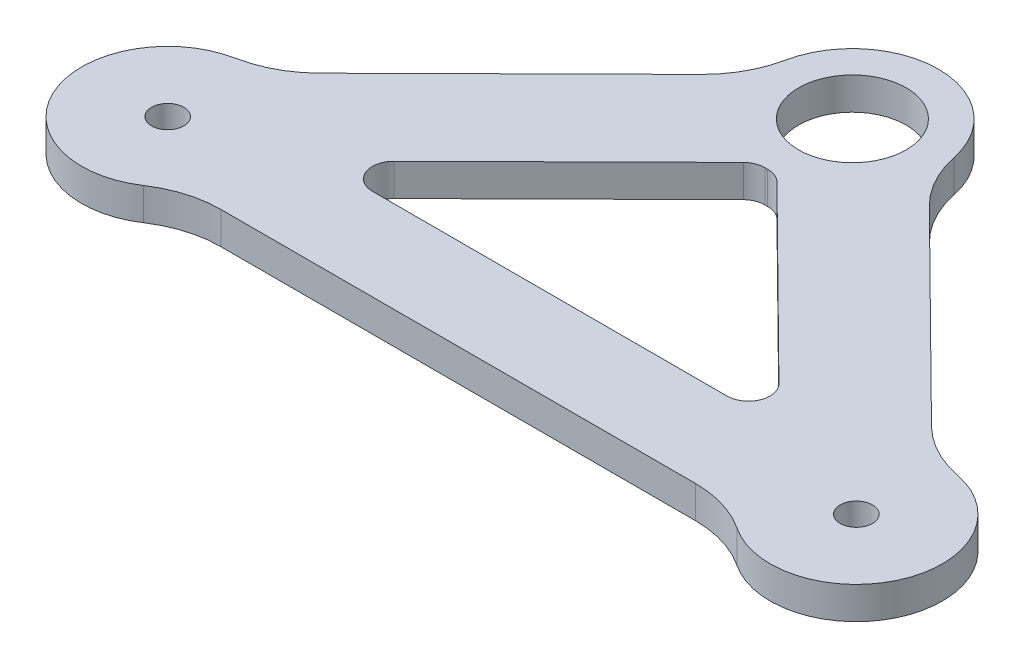
ISO-10303-21;
HEADER;
FILE_DESCRIPTION(('STEP AP214'),'2;1');
FILE_NAME('part.step','',(''),(''),'','','');
FILE_SCHEMA(('AUTOMOTIVE_DESIGN { 1 0 10303 214 1 1 1 1 }'));
ENDSEC;
DATA;
#1=APPLICATION_CONTEXT('core data for automotive mechanical design processes');
#2=APPLICATION_PROTOCOL_DEFINITION('international standard','automotive_design',2000,#1);
#3=PRODUCT_CONTEXT('',#1,'mechanical');
#4=PRODUCT('Part','Part','',(#3));
#5=PRODUCT_RELATED_PRODUCT_CATEGORY('part','',(#4));
#6=PRODUCT_DEFINITION_FORMATION('','',#4);
#7=PRODUCT_DEFINITION_CONTEXT('part definition',#1,'design');
#8=PRODUCT_DEFINITION('design','',#6,#7);
#9=PRODUCT_DEFINITION_SHAPE('','',#8);
#10=(LENGTH_UNIT() NAMED_UNIT(*) SI_UNIT(.MILLI.,.METRE.));
#11=(NAMED_UNIT(*) PLANE_ANGLE_UNIT() SI_UNIT($,.RADIAN.));
#12=(NAMED_UNIT(*) SI_UNIT($,.STERADIAN.) SOLID_ANGLE_UNIT());
#13=UNCERTAINTY_MEASURE_WITH_UNIT(LENGTH_MEASURE(1.E-05),#10,'distance_accuracy_value','');
#14=(GEOMETRIC_REPRESENTATION_CONTEXT(3) GLOBAL_UNCERTAINTY_ASSIGNED_CONTEXT((#13)) GLOBAL_UNIT_ASSIGNED_CONTEXT((#10,
#11,#12)) REPRESENTATION_CONTEXT('',''));
#15=CARTESIAN_POINT('',(0.,0.,0.));
#16=DIRECTION('',(0.,0.,1.));
#17=DIRECTION('',(1.,0.,0.));
#18=AXIS2_PLACEMENT_3D('',#15,#16,#17);
#19=CARTESIAN_POINT('',(0.,3.,0.));
#20=DIRECTION('',(1.,0.,0.));
#21=DIRECTION('',(0.,0.,-1.));
#22=AXIS2_PLACEMENT_3D('',#19,#20,#21);
#23=PLANE('',#22);
#24=DIRECTION('',(0.,0.,1.));
#25=VECTOR('',#24,1.);
#26=CARTESIAN_POINT('',(0.,0.,0.));
#27=LINE('',#26,#25);
#28=CARTESIAN_POINT('',(0.,0.,-22.5169864866705));
#29=VERTEX_POINT('',#28);
#30=CARTESIAN_POINT('',(0.,0.,-22.5158134829802));
#31=VERTEX_POINT('',#30);
#32=EDGE_CURVE('E197',#29,#31,#27,.T.);
#33=ORIENTED_EDGE('',*,*,#32,.F.);
#34=DIRECTION('',(0.,-1.,0.));
#35=VECTOR('',#34,1.);
#36=CARTESIAN_POINT('',(0.,3.,-22.5169864866705));
#37=LINE('',#36,#35);
#38=CARTESIAN_POINT('',(0.,3.,-22.5169864866705));
#39=VERTEX_POINT('',#38);
#40=EDGE_CURVE('E191',#39,#29,#37,.T.);
#41=ORIENTED_EDGE('',*,*,#40,.F.);
#42=DIRECTION('',(0.,0.,1.));
#43=VECTOR('',#42,1.);
#44=CARTESIAN_POINT('',(0.,3.,0.));
#45=LINE('',#44,#43);
#46=CARTESIAN_POINT('',(0.,3.,-22.5158134829802));
#47=VERTEX_POINT('',#46);
#48=EDGE_CURVE('E194',#39,#47,#45,.T.);
#49=ORIENTED_EDGE('',*,*,#48,.T.);
#50=DIRECTION('',(0.,-1.,0.));
#51=VECTOR('',#50,1.);
#52=CARTESIAN_POINT('',(0.,3.,-22.5158134829802));
#53=LINE('',#52,#51);
#54=EDGE_CURVE('E229',#47,#31,#53,.T.);
#55=ORIENTED_EDGE('',*,*,#54,.T.);
#56=EDGE_LOOP('',(#33,#41,#49,#55));
#57=FACE_BOUND('',#56,.T.);
#58=ADVANCED_FACE('F36',(#57),#23,.T.);
#59=CARTESIAN_POINT('',(11.2577723363418,3.,-11.3858986330326));
#60=DIRECTION('',(0.703094453053331,0.,-0.711096470308802));
#61=DIRECTION('',(-0.711096470308802,0.,-0.703094453053331));
#62=AXIS2_PLACEMENT_3D('',#59,#60,#61);
#63=PLANE('',#62);
#64=DIRECTION('',(0.711096470308802,0.,0.703094453053331));
#65=VECTOR('',#64,1.);
#66=CARTESIAN_POINT('',(11.2577723363418,0.,-11.3858986330326));
#67=LINE('',#66,#65);
#68=CARTESIAN_POINT('',(0.000593189258373851,0.,-22.5163999726115));
#69=VERTEX_POINT('',#68);
#70=EDGE_CURVE('E260',#29,#69,#67,.T.);
#71=ORIENTED_EDGE('',*,*,#70,.T.);
#72=DIRECTION('',(0.,-1.,0.));
#73=VECTOR('',#72,1.);
#74=CARTESIAN_POINT('',(0.000593189258373851,3.,-22.5163999726115));
#75=LINE('',#74,#73);
#76=CARTESIAN_POINT('',(0.000593189258373851,3.,-22.5163999726115));
#77=VERTEX_POINT('',#76);
#78=EDGE_CURVE('E202',#77,#69,#75,.T.);
#79=ORIENTED_EDGE('',*,*,#78,.F.);
#80=DIRECTION('',(0.711096470308802,0.,0.703094453053331));
#81=VECTOR('',#80,1.);
#82=CARTESIAN_POINT('',(11.2577723363418,3.,-11.3858986330326));
#83=LINE('',#82,#81);
#84=EDGE_CURVE('E205',#39,#77,#83,.T.);
#85=ORIENTED_EDGE('',*,*,#84,.F.);
#86=ORIENTED_EDGE('',*,*,#40,.T.);
#87=EDGE_LOOP('',(#71,#79,#85,#86));
#88=FACE_BOUND('',#87,.T.);
#89=ADVANCED_FACE('F206',(#88),#63,.F.);
#90=CARTESIAN_POINT('',(11.2577723363418,3.,-11.3858986330326));
#91=DIRECTION('',(0.703094453053331,0.,-0.711096470308802));
#92=DIRECTION('',(-0.711096470308802,0.,-0.703094453053331));
#93=AXIS2_PLACEMENT_3D('',#90,#91,#92);
#94=PLANE('',#93);
#95=DIRECTION('',(0.711096470308802,0.,0.703094453053331));
#96=VECTOR('',#95,1.);
#97=CARTESIAN_POINT('',(11.2577723363418,0.,-11.3858986330326));
#98=LINE('',#97,#96);
#99=CARTESIAN_POINT('',(1.56408418580728,0.,-20.9705030472689));
#100=VERTEX_POINT('',#99);
#101=CARTESIAN_POINT('',(17.8876045404997,0.,-4.83067238448501));
#102=VERTEX_POINT('',#101);
#103=EDGE_CURVE('E248',#100,#102,#98,.T.);
#104=ORIENTED_EDGE('',*,*,#103,.T.);
#105=DIRECTION('',(0.,-1.,0.));
#106=VECTOR('',#105,1.);
#107=CARTESIAN_POINT('',(17.8876045404997,3.,-4.83067238448501));
#108=LINE('',#107,#106);
#109=CARTESIAN_POINT('',(17.8876045404997,3.,-4.83067238448501));
#110=VERTEX_POINT('',#109);
#111=EDGE_CURVE('E338',#102,#110,#108,.F.);
#112=ORIENTED_EDGE('',*,*,#111,.T.);
#113=DIRECTION('',(0.711096470308802,0.,0.703094453053331));
#114=VECTOR('',#113,1.);
#115=CARTESIAN_POINT('',(11.2577723363418,3.,-11.3858986330326));
#116=LINE('',#115,#114);
#117=CARTESIAN_POINT('',(1.56408418580728,3.,-20.9705030472689));
#118=VERTEX_POINT('',#117);
#119=EDGE_CURVE('E383',#118,#110,#116,.T.);
#120=ORIENTED_EDGE('',*,*,#119,.F.);
#121=DIRECTION('',(0.,1.,0.));
#122=VECTOR('',#121,1.);
#123=CARTESIAN_POINT('',(1.56408418580728,0.,-20.9705030472689));
#124=LINE('',#123,#122);
#125=EDGE_CURVE('E335',#118,#100,#124,.F.);
#126=ORIENTED_EDGE('',*,*,#125,.T.);
#127=EDGE_LOOP('',(#104,#112,#120,#126));
#128=FACE_BOUND('',#127,.T.);
#129=ADVANCED_FACE('F381',(#128),#94,.F.);
#130=CARTESIAN_POINT('',(0.,3.,-1.4084794438674));
#131=DIRECTION('',(0.,0.,-1.));
#132=DIRECTION('',(-1.,0.,0.));
#133=AXIS2_PLACEMENT_3D('',#130,#131,#132);
#134=PLANE('',#133);
#135=DIRECTION('',(1.,0.,0.));
#136=VECTOR('',#135,1.);
#137=CARTESIAN_POINT('',(0.,3.,-1.4084794438674));
#138=LINE('',#137,#136);
#139=CARTESIAN_POINT('',(-16.4809742625331,3.,-1.4084794438674));
#140=VERTEX_POINT('',#139);
#141=CARTESIAN_POINT('',(16.481415634393,3.,-1.4084794438674));
#142=VERTEX_POINT('',#141);
#143=EDGE_CURVE('E394',#140,#142,#138,.T.);
#144=ORIENTED_EDGE('',*,*,#143,.T.);
#145=DIRECTION('',(0.,-1.,0.));
#146=VECTOR('',#145,1.);
#147=CARTESIAN_POINT('',(16.481415634393,3.,-1.4084794438674));
#148=LINE('',#147,#146);
#149=CARTESIAN_POINT('',(16.481415634393,0.,-1.4084794438674));
#150=VERTEX_POINT('',#149);
#151=EDGE_CURVE('E332',#142,#150,#148,.T.);
#152=ORIENTED_EDGE('',*,*,#151,.T.);
#153=DIRECTION('',(1.,0.,0.));
#154=VECTOR('',#153,1.);
#155=CARTESIAN_POINT('',(0.,0.,-1.4084794438674));
#156=LINE('',#155,#154);
#157=CARTESIAN_POINT('',(-16.4809742625331,0.,-1.4084794438674));
#158=VERTEX_POINT('',#157);
#159=EDGE_CURVE('E251',#158,#150,#156,.T.);
#160=ORIENTED_EDGE('',*,*,#159,.F.);
#161=DIRECTION('',(0.,-1.,0.));
#162=VECTOR('',#161,1.);
#163=CARTESIAN_POINT('',(-16.4809742625331,3.,-1.4084794438674));
#164=LINE('',#163,#162);
#165=EDGE_CURVE('E330',#158,#140,#164,.F.);
#166=ORIENTED_EDGE('',*,*,#165,.T.);
#167=EDGE_LOOP('',(#144,#152,#160,#166));
#168=FACE_BOUND('',#167,.T.);
#169=ADVANCED_FACE('F391',(#168),#134,.T.);
#170=CARTESIAN_POINT('',(-11.257180556488,3.,-11.3857743242329));
#171=DIRECTION('',(-0.703079645313617,0.,-0.711111111111111));
#172=DIRECTION('',(-0.711111111111111,0.,0.703079645313617));
#173=AXIS2_PLACEMENT_3D('',#170,#171,#172);
#174=PLANE('',#173);
#175=DIRECTION('',(0.711111111111111,0.,-0.703079645313617));
#176=VECTOR('',#175,1.);
#177=CARTESIAN_POINT('',(-11.257180556488,3.,-11.3857743242329));
#178=LINE('',#177,#176);
#179=CARTESIAN_POINT('',(-17.8871335531603,3.,-4.83070166608962));
#180=VERTEX_POINT('',#179);
#181=CARTESIAN_POINT('',(-1.56295087817351,3.,-20.9705149608521));
#182=VERTEX_POINT('',#181);
#183=EDGE_CURVE('E215',#180,#182,#178,.T.);
#184=ORIENTED_EDGE('',*,*,#183,.F.);
#185=DIRECTION('',(0.,-1.,0.));
#186=VECTOR('',#185,1.);
#187=CARTESIAN_POINT('',(-17.8871335531603,3.,-4.83070166608962));
#188=LINE('',#187,#186);
#189=CARTESIAN_POINT('',(-17.8871335531603,0.,-4.83070166608962));
#190=VERTEX_POINT('',#189);
#191=EDGE_CURVE('E342',#180,#190,#188,.T.);
#192=ORIENTED_EDGE('',*,*,#191,.T.);
#193=DIRECTION('',(0.711111111111111,0.,-0.703079645313617));
#194=VECTOR('',#193,1.);
#195=CARTESIAN_POINT('',(-11.257180556488,0.,-11.3857743242329));
#196=LINE('',#195,#194);
#197=CARTESIAN_POINT('',(-1.56295087817351,0.,-20.9705149608521));
#198=VERTEX_POINT('',#197);
#199=EDGE_CURVE('E254',#190,#198,#196,.T.);
#200=ORIENTED_EDGE('',*,*,#199,.T.);
#201=DIRECTION('',(0.,1.,0.));
#202=VECTOR('',#201,1.);
#203=CARTESIAN_POINT('',(-1.56295087817351,3.,-20.9705149608521));
#204=LINE('',#203,#202);
#205=EDGE_CURVE('E340',#198,#182,#204,.T.);
#206=ORIENTED_EDGE('',*,*,#205,.T.);
#207=EDGE_LOOP('',(#184,#192,#200,#206));
#208=FACE_BOUND('',#207,.T.);
#209=ADVANCED_FACE('F371',(#208),#174,.F.);
#210=CARTESIAN_POINT('',(0.,3.,7.09152055613258));
#211=DIRECTION('',(0.,0.,-1.));
#212=DIRECTION('',(-1.,0.,0.));
#213=AXIS2_PLACEMENT_3D('',#210,#211,#212);
#214=PLANE('',#213);
#215=DIRECTION('',(1.,0.,0.));
#216=VECTOR('',#215,1.);
#217=CARTESIAN_POINT('',(0.,0.,7.09152055613258));
#218=LINE('',#217,#216);
#219=CARTESIAN_POINT('',(-22.0501256289338,0.,7.09152055613258));
#220=VERTEX_POINT('',#219);
#221=CARTESIAN_POINT('',(22.0501256289338,0.,7.09152055613259));
#222=VERTEX_POINT('',#221);
#223=EDGE_CURVE('E230',#220,#222,#218,.T.);
#224=ORIENTED_EDGE('',*,*,#223,.T.);
#225=DIRECTION('',(0.,1.,0.));
#226=VECTOR('',#225,1.);
#227=CARTESIAN_POINT('',(22.0501256289338,3.,7.09152055613259));
#228=LINE('',#227,#226);
#229=CARTESIAN_POINT('',(22.0501256289338,3.,7.09152055613259));
#230=VERTEX_POINT('',#229);
#231=EDGE_CURVE('E294',#222,#230,#228,.T.);
#232=ORIENTED_EDGE('',*,*,#231,.T.);
#233=DIRECTION('',(1.,0.,0.));
#234=VECTOR('',#233,1.);
#235=CARTESIAN_POINT('',(0.,3.,7.09152055613258));
#236=LINE('',#235,#234);
#237=CARTESIAN_POINT('',(-22.0501256289338,3.,7.09152055613258));
#238=VERTEX_POINT('',#237);
#239=EDGE_CURVE('E274',#238,#230,#236,.T.);
#240=ORIENTED_EDGE('',*,*,#239,.F.);
#241=DIRECTION('',(0.,1.,0.));
#242=VECTOR('',#241,1.);
#243=CARTESIAN_POINT('',(-22.0501256289338,0.,7.09152055613258));
#244=LINE('',#243,#242);
#245=EDGE_CURVE('E291',#238,#220,#244,.F.);
#246=ORIENTED_EDGE('',*,*,#245,.T.);
#247=EDGE_LOOP('',(#224,#232,#240,#246));
#248=FACE_BOUND('',#247,.T.);
#249=ADVANCED_FACE('F470',(#248),#214,.F.);
#250=CARTESIAN_POINT('',(32.,3.,2.09152055613259));
#251=DIRECTION('',(0.,-1.,0.));
#252=DIRECTION('',(0.,0.,-1.));
#253=AXIS2_PLACEMENT_3D('',#250,#251,#252);
#254=CYLINDRICAL_SURFACE('',#253,8.);
#255=CARTESIAN_POINT('',(32.,0.,2.09152055613259));
#256=DIRECTION('',(0.,1.,0.));
#257=DIRECTION('',(0.,0.,1.));
#258=AXIS2_PLACEMENT_3D('',#255,#256,#257);
#259=CIRCLE('',#258,8.);
#260=CARTESIAN_POINT('',(27.5778336128595,0.,8.75818722279926));
#261=VERTEX_POINT('',#260);
#262=CARTESIAN_POINT('',(33.5419702056243,0.,-5.7584684811188));
#263=VERTEX_POINT('',#262);
#264=EDGE_CURVE('E233',#261,#263,#259,.T.);
#265=ORIENTED_EDGE('',*,*,#264,.T.);
#266=DIRECTION('',(0.,-1.,0.));
#267=VECTOR('',#266,1.);
#268=CARTESIAN_POINT('',(33.5419702056243,3.,-5.7584684811188));
#269=LINE('',#268,#267);
#270=CARTESIAN_POINT('',(33.5419702056243,3.,-5.7584684811188));
#271=VERTEX_POINT('',#270);
#272=EDGE_CURVE('E289',#263,#271,#269,.F.);
#273=ORIENTED_EDGE('',*,*,#272,.T.);
#274=CARTESIAN_POINT('',(32.,3.,2.09152055613259));
#275=DIRECTION('',(0.,1.,0.));
#276=DIRECTION('',(0.,0.,1.));
#277=AXIS2_PLACEMENT_3D('',#274,#275,#276);
#278=CIRCLE('',#277,8.);
#279=CARTESIAN_POINT('',(27.5778336128595,3.,8.75818722279926));
#280=VERTEX_POINT('',#279);
#281=EDGE_CURVE('E411',#280,#271,#278,.T.);
#282=ORIENTED_EDGE('',*,*,#281,.F.);
#283=DIRECTION('',(0.,-1.,0.));
#284=VECTOR('',#283,1.);
#285=CARTESIAN_POINT('',(27.5778336128595,3.,8.75818722279926));
#286=LINE('',#285,#284);
#287=EDGE_CURVE('E286',#280,#261,#286,.T.);
#288=ORIENTED_EDGE('',*,*,#287,.T.);
#289=EDGE_LOOP('',(#265,#273,#282,#288));
#290=FACE_BOUND('',#289,.T.);
#291=ADVANCED_FACE('F428',(#290),#254,.T.);
#292=CARTESIAN_POINT('',(18.2880580238333,3.,-18.4961969946937));
#293=DIRECTION('',(-0.70309445305332,0.,0.711096470308813));
#294=DIRECTION('',(0.711096470308813,0.,0.70309445305332));
#295=AXIS2_PLACEMENT_3D('',#292,#293,#294);
#296=PLANE('',#295);
#297=DIRECTION('',(-0.711096470308813,0.,-0.70309445305332));
#298=VECTOR('',#297,1.);
#299=CARTESIAN_POINT('',(18.2880580238333,0.,-18.4961969946937));
#300=LINE('',#299,#298);
#301=CARTESIAN_POINT('',(28.4384884321214,0.,-8.45999007459491));
#302=VERTEX_POINT('',#301);
#303=CARTESIAN_POINT('',(10.5907928105479,0.,-26.1068443556502));
#304=VERTEX_POINT('',#303);
#305=EDGE_CURVE('E236',#302,#304,#300,.T.);
#306=ORIENTED_EDGE('',*,*,#305,.T.);
#307=DIRECTION('',(0.,1.,0.));
#308=VECTOR('',#307,1.);
#309=CARTESIAN_POINT('',(10.5907928105479,3.,-26.1068443556502));
#310=LINE('',#309,#308);
#311=CARTESIAN_POINT('',(10.5907928105479,3.,-26.1068443556502));
#312=VERTEX_POINT('',#311);
#313=EDGE_CURVE('E284',#304,#312,#310,.T.);
#314=ORIENTED_EDGE('',*,*,#313,.T.);
#315=DIRECTION('',(-0.711096470308813,0.,-0.70309445305332));
#316=VECTOR('',#315,1.);
#317=CARTESIAN_POINT('',(18.2880580238333,3.,-18.4961969946937));
#318=LINE('',#317,#316);
#319=CARTESIAN_POINT('',(28.4384884321214,3.,-8.45999007459491));
#320=VERTEX_POINT('',#319);
#321=EDGE_CURVE('E408',#320,#312,#318,.T.);
#322=ORIENTED_EDGE('',*,*,#321,.F.);
#323=DIRECTION('',(0.,1.,0.));
#324=VECTOR('',#323,1.);
#325=CARTESIAN_POINT('',(28.4384884321214,0.,-8.45999007459491));
#326=LINE('',#325,#324);
#327=EDGE_CURVE('E281',#320,#302,#326,.F.);
#328=ORIENTED_EDGE('',*,*,#327,.T.);
#329=EDGE_LOOP('',(#306,#314,#322,#328));
#330=FACE_BOUND('',#329,.T.);
#331=ADVANCED_FACE('F439',(#330),#296,.F.);
#332=CARTESIAN_POINT('',(0.,3.,-29.5470634829801));
#333=DIRECTION('',(0.,-1.,0.));
#334=DIRECTION('',(0.,0.,-1.));
#335=AXIS2_PLACEMENT_3D('',#332,#333,#334);
#336=CYLINDRICAL_SURFACE('',#335,8.);
#337=CARTESIAN_POINT('',(0.,3.,-29.5470634829801));
#338=DIRECTION('',(0.,1.,0.));
#339=DIRECTION('',(0.,0.,1.));
#340=AXIS2_PLACEMENT_3D('',#337,#338,#339);
#341=CIRCLE('',#340,8.);
#342=CARTESIAN_POINT('',(7.83188326270271,3.,-31.1785059610949));
#343=VERTEX_POINT('',#342);
#344=CARTESIAN_POINT('',(-7.83184928850183,3.,-31.1786690487323));
#345=VERTEX_POINT('',#344);
#346=EDGE_CURVE('E405',#343,#345,#341,.T.);
#347=ORIENTED_EDGE('',*,*,#346,.F.);
#348=DIRECTION('',(0.,-1.,0.));
#349=VECTOR('',#348,1.);
#350=CARTESIAN_POINT('',(7.83188326270271,3.,-31.1785059610949));
#351=LINE('',#350,#349);
#352=CARTESIAN_POINT('',(7.83188326270271,0.,-31.1785059610949));
#353=VERTEX_POINT('',#352);
#354=EDGE_CURVE('E278',#343,#353,#351,.T.);
#355=ORIENTED_EDGE('',*,*,#354,.T.);
#356=CARTESIAN_POINT('',(0.,0.,-29.5470634829801));
#357=DIRECTION('',(0.,1.,0.));
#358=DIRECTION('',(0.,0.,1.));
#359=AXIS2_PLACEMENT_3D('',#356,#357,#358);
#360=CIRCLE('',#359,8.);
#361=CARTESIAN_POINT('',(-7.83184928850183,0.,-31.1786690487323));
#362=VERTEX_POINT('',#361);
#363=EDGE_CURVE('E239',#353,#362,#360,.T.);
#364=ORIENTED_EDGE('',*,*,#363,.T.);
#365=DIRECTION('',(0.,-1.,0.));
#366=VECTOR('',#365,1.);
#367=CARTESIAN_POINT('',(-7.83184928850183,3.,-31.1786690487323));
#368=LINE('',#367,#366);
#369=EDGE_CURVE('E201',#362,#345,#368,.F.);
#370=ORIENTED_EDGE('',*,*,#369,.T.);
#371=EDGE_LOOP('',(#347,#355,#364,#370));
#372=FACE_BOUND('',#371,.T.);
#373=ADVANCED_FACE('F448',(#372),#336,.T.);
#374=CARTESIAN_POINT('',(-18.2879770096242,3.,-18.496885435344));
#375=DIRECTION('',(-0.703079645313617,0.,-0.711111111111111));
#376=DIRECTION('',(-0.711111111111111,0.,0.703079645313617));
#377=AXIS2_PLACEMENT_3D('',#374,#375,#376);
#378=PLANE('',#377);
#379=DIRECTION('',(0.711111111111111,0.,-0.703079645313617));
#380=VECTOR('',#379,1.);
#381=CARTESIAN_POINT('',(-18.2879770096242,0.,-18.496885435344));
#382=LINE('',#381,#380);
#383=CARTESIAN_POINT('',(-28.4399320071432,0.,-8.45958914314723));
#384=VERTEX_POINT('',#383);
#385=CARTESIAN_POINT('',(-10.5908644459929,0.,-26.1070648948114));
#386=VERTEX_POINT('',#385);
#387=EDGE_CURVE('E242',#384,#386,#382,.T.);
#388=ORIENTED_EDGE('',*,*,#387,.F.);
#389=DIRECTION('',(0.,-1.,0.));
#390=VECTOR('',#389,1.);
#391=CARTESIAN_POINT('',(-28.4399320071432,3.,-8.45958914314724));
#392=LINE('',#391,#390);
#393=CARTESIAN_POINT('',(-28.4399320071432,3.,-8.45958914314723));
#394=VERTEX_POINT('',#393);
#395=EDGE_CURVE('E304',#384,#394,#392,.F.);
#396=ORIENTED_EDGE('',*,*,#395,.T.);
#397=DIRECTION('',(0.711111111111111,0.,-0.703079645313617));
#398=VECTOR('',#397,1.);
#399=CARTESIAN_POINT('',(-18.2879770096242,3.,-18.496885435344));
#400=LINE('',#399,#398);
#401=CARTESIAN_POINT('',(-10.5908644459929,3.,-26.1070648948114));
#402=VERTEX_POINT('',#401);
#403=EDGE_CURVE('E402',#394,#402,#400,.T.);
#404=ORIENTED_EDGE('',*,*,#403,.T.);
#405=DIRECTION('',(0.,-1.,0.));
#406=VECTOR('',#405,1.);
#407=CARTESIAN_POINT('',(-10.5908644459929,3.,-26.1070648948114));
#408=LINE('',#407,#406);
#409=EDGE_CURVE('E301',#402,#386,#408,.T.);
#410=ORIENTED_EDGE('',*,*,#409,.T.);
#411=EDGE_LOOP('',(#388,#396,#404,#410));
#412=FACE_BOUND('',#411,.T.);
#413=ADVANCED_FACE('F456',(#412),#378,.T.);
#414=CARTESIAN_POINT('',(-32.,3.,2.0915205561326));
#415=DIRECTION('',(0.,-1.,0.));
#416=DIRECTION('',(0.,0.,-1.));
#417=AXIS2_PLACEMENT_3D('',#414,#415,#416);
#418=CYLINDRICAL_SURFACE('',#417,1.5);
#419=CARTESIAN_POINT('',(-32.,3.,2.0915205561326));
#420=DIRECTION('',(0.,1.,0.));
#421=DIRECTION('',(0.,0.,1.));
#422=AXIS2_PLACEMENT_3D('',#419,#420,#421);
#423=CIRCLE('',#422,1.5);
#424=CARTESIAN_POINT('',(-32.,3.,3.5915205561326));
#425=VERTEX_POINT('',#424);
#426=EDGE_CURVE('E223',#425,#425,#423,.T.);
#427=ORIENTED_EDGE('',*,*,#426,.T.);
#428=EDGE_LOOP('',(#427));
#429=FACE_BOUND('',#428,.T.);
#430=CARTESIAN_POINT('',(-32.,0.,2.0915205561326));
#431=DIRECTION('',(0.,1.,0.));
#432=DIRECTION('',(0.,0.,1.));
#433=AXIS2_PLACEMENT_3D('',#430,#431,#432);
#434=CIRCLE('',#433,1.5);
#435=CARTESIAN_POINT('',(-32.,0.,3.5915205561326));
#436=VERTEX_POINT('',#435);
#437=EDGE_CURVE('E268',#436,#436,#434,.T.);
#438=ORIENTED_EDGE('',*,*,#437,.F.);
#439=EDGE_LOOP('',(#438));
#440=FACE_BOUND('',#439,.T.);
#441=ADVANCED_FACE('F500',(#429,#440),#418,.F.);
#442=CARTESIAN_POINT('',(0.,3.,-29.5470634829801));
#443=DIRECTION('',(0.,-1.,0.));
#444=DIRECTION('',(0.,0.,-1.));
#445=AXIS2_PLACEMENT_3D('',#442,#443,#444);
#446=CYLINDRICAL_SURFACE('',#445,5.);
#447=CARTESIAN_POINT('',(0.,3.,-29.5470634829801));
#448=DIRECTION('',(0.,1.,0.));
#449=DIRECTION('',(0.,0.,1.));
#450=AXIS2_PLACEMENT_3D('',#447,#448,#449);
#451=CIRCLE('',#450,5.);
#452=CARTESIAN_POINT('',(0.,3.,-24.5470634829801));
#453=VERTEX_POINT('',#452);
#454=EDGE_CURVE('E220',#453,#453,#451,.T.);
#455=ORIENTED_EDGE('',*,*,#454,.T.);
#456=EDGE_LOOP('',(#455));
#457=FACE_BOUND('',#456,.T.);
#458=CARTESIAN_POINT('',(0.,0.,-29.5470634829801));
#459=DIRECTION('',(0.,1.,0.));
#460=DIRECTION('',(0.,0.,1.));
#461=AXIS2_PLACEMENT_3D('',#458,#459,#460);
#462=CIRCLE('',#461,5.);
#463=CARTESIAN_POINT('',(0.,0.,-24.5470634829801));
#464=VERTEX_POINT('',#463);
#465=EDGE_CURVE('E265',#464,#464,#462,.T.);
#466=ORIENTED_EDGE('',*,*,#465,.F.);
#467=EDGE_LOOP('',(#466));
#468=FACE_BOUND('',#467,.T.);
#469=ADVANCED_FACE('F523',(#457,#468),#446,.F.);
#470=CARTESIAN_POINT('',(-11.257180556488,3.,-11.3857743242329));
#471=DIRECTION('',(-0.703079645313617,0.,-0.711111111111111));
#472=DIRECTION('',(-0.711111111111111,0.,0.703079645313617));
#473=AXIS2_PLACEMENT_3D('',#470,#471,#472);
#474=PLANE('',#473);
#475=DIRECTION('',(0.711111111111111,0.,-0.703079645313617));
#476=VECTOR('',#475,1.);
#477=CARTESIAN_POINT('',(-11.257180556488,0.,-11.3857743242329));
#478=LINE('',#477,#476);
#479=EDGE_CURVE('E262',#31,#69,#478,.T.);
#480=ORIENTED_EDGE('',*,*,#479,.F.);
#481=ORIENTED_EDGE('',*,*,#54,.F.);
#482=DIRECTION('',(0.711111111111111,0.,-0.703079645313617));
#483=VECTOR('',#482,1.);
#484=CARTESIAN_POINT('',(-11.257180556488,3.,-11.3857743242329));
#485=LINE('',#484,#483);
#486=EDGE_CURVE('E209',#47,#77,#485,.T.);
#487=ORIENTED_EDGE('',*,*,#486,.T.);
#488=ORIENTED_EDGE('',*,*,#78,.T.);
#489=EDGE_LOOP('',(#480,#481,#487,#488));
#490=FACE_BOUND('',#489,.T.);
#491=ADVANCED_FACE('F489',(#490),#474,.T.);
#492=CARTESIAN_POINT('',(0.,3.,-29.5470634829801));
#493=DIRECTION('',(0.,-1.,0.));
#494=DIRECTION('',(0.,0.,-1.));
#495=AXIS2_PLACEMENT_3D('',#492,#493,#494);
#496=CYLINDRICAL_SURFACE('',#495,8.);
#497=CARTESIAN_POINT('',(0.,0.,-29.5470634829801));
#498=DIRECTION('',(0.,1.,0.));
#499=DIRECTION('',(0.,0.,1.));
#500=AXIS2_PLACEMENT_3D('',#497,#498,#499);
#501=CIRCLE('',#500,8.);
#502=CARTESIAN_POINT('',(-0.125433270037022,0.,-21.5480468874999));
#503=VERTEX_POINT('',#502);
#504=CARTESIAN_POINT('',(0.126316223760494,0.,-21.548060781917));
#505=VERTEX_POINT('',#504);
#506=EDGE_CURVE('E257',#503,#505,#501,.T.);
#507=ORIENTED_EDGE('',*,*,#506,.T.);
#508=DIRECTION('',(0.,-1.,0.));
#509=VECTOR('',#508,1.);
#510=CARTESIAN_POINT('',(0.126316223760494,3.,-21.548060781917));
#511=LINE('',#510,#509);
#512=CARTESIAN_POINT('',(0.126316223760494,3.,-21.548060781917));
#513=VERTEX_POINT('',#512);
#514=EDGE_CURVE('E51',#505,#513,#511,.F.);
#515=ORIENTED_EDGE('',*,*,#514,.T.);
#516=CARTESIAN_POINT('',(0.,3.,-29.5470634829801));
#517=DIRECTION('',(0.,1.,0.));
#518=DIRECTION('',(0.,0.,1.));
#519=AXIS2_PLACEMENT_3D('',#516,#517,#518);
#520=CIRCLE('',#519,8.);
#521=CARTESIAN_POINT('',(-0.125433270037022,3.,-21.5480468874999));
#522=VERTEX_POINT('',#521);
#523=EDGE_CURVE('E213',#522,#513,#520,.T.);
#524=ORIENTED_EDGE('',*,*,#523,.F.);
#525=DIRECTION('',(0.,-1.,0.));
#526=VECTOR('',#525,1.);
#527=CARTESIAN_POINT('',(-0.125433270037022,3.,-21.5480468874999));
#528=LINE('',#527,#526);
#529=EDGE_CURVE('E345',#522,#503,#528,.T.);
#530=ORIENTED_EDGE('',*,*,#529,.T.);
#531=EDGE_LOOP('',(#507,#515,#524,#530));
#532=FACE_BOUND('',#531,.T.);
#533=ADVANCED_FACE('F373',(#532),#496,.T.);
#534=CARTESIAN_POINT('',(-32.,3.,2.0915205561326));
#535=DIRECTION('',(0.,-1.,0.));
#536=DIRECTION('',(0.,0.,-1.));
#537=AXIS2_PLACEMENT_3D('',#534,#535,#536);
#538=CYLINDRICAL_SURFACE('',#537,8.);
#539=CARTESIAN_POINT('',(-32.,0.,2.0915205561326));
#540=DIRECTION('',(0.,1.,0.));
#541=DIRECTION('',(0.,0.,1.));
#542=AXIS2_PLACEMENT_3D('',#539,#540,#541);
#543=CIRCLE('',#542,8.);
#544=CARTESIAN_POINT('',(-33.5425459823464,0.,-5.75835535959671));
#545=VERTEX_POINT('',#544);
#546=CARTESIAN_POINT('',(-27.5778336128595,0.,8.75818722279926));
#547=VERTEX_POINT('',#546);
#548=EDGE_CURVE('E245',#545,#547,#543,.T.);
#549=ORIENTED_EDGE('',*,*,#548,.T.);
#550=DIRECTION('',(0.,-1.,0.));
#551=VECTOR('',#550,1.);
#552=CARTESIAN_POINT('',(-27.5778336128595,3.,8.75818722279926));
#553=LINE('',#552,#551);
#554=CARTESIAN_POINT('',(-27.5778336128595,3.,8.75818722279926));
#555=VERTEX_POINT('',#554);
#556=EDGE_CURVE('E299',#547,#555,#553,.F.);
#557=ORIENTED_EDGE('',*,*,#556,.T.);
#558=CARTESIAN_POINT('',(-32.,3.,2.0915205561326));
#559=DIRECTION('',(0.,1.,0.));
#560=DIRECTION('',(0.,0.,1.));
#561=AXIS2_PLACEMENT_3D('',#558,#559,#560);
#562=CIRCLE('',#561,8.);
#563=CARTESIAN_POINT('',(-33.5425459823464,3.,-5.75835535959671));
#564=VERTEX_POINT('',#563);
#565=EDGE_CURVE('E397',#564,#555,#562,.T.);
#566=ORIENTED_EDGE('',*,*,#565,.F.);
#567=DIRECTION('',(0.,-1.,0.));
#568=VECTOR('',#567,1.);
#569=CARTESIAN_POINT('',(-33.5425459823464,3.,-5.75835535959671));
#570=LINE('',#569,#568);
#571=EDGE_CURVE('E296',#564,#545,#570,.T.);
#572=ORIENTED_EDGE('',*,*,#571,.T.);
#573=EDGE_LOOP('',(#549,#557,#566,#572));
#574=FACE_BOUND('',#573,.T.);
#575=ADVANCED_FACE('F466',(#574),#538,.T.);
#576=CARTESIAN_POINT('',(32.,3.,2.09152055613259));
#577=DIRECTION('',(0.,-1.,0.));
#578=DIRECTION('',(0.,0.,-1.));
#579=AXIS2_PLACEMENT_3D('',#576,#577,#578);
#580=CYLINDRICAL_SURFACE('',#579,1.5);
#581=CARTESIAN_POINT('',(32.,3.,2.09152055613259));
#582=DIRECTION('',(0.,1.,0.));
#583=DIRECTION('',(0.,0.,1.));
#584=AXIS2_PLACEMENT_3D('',#581,#582,#583);
#585=CIRCLE('',#584,1.5);
#586=CARTESIAN_POINT('',(32.,3.,3.59152055613259));
#587=VERTEX_POINT('',#586);
#588=EDGE_CURVE('E226',#587,#587,#585,.T.);
#589=ORIENTED_EDGE('',*,*,#588,.T.);
#590=EDGE_LOOP('',(#589));
#591=FACE_BOUND('',#590,.T.);
#592=CARTESIAN_POINT('',(32.,0.,2.09152055613259));
#593=DIRECTION('',(0.,1.,0.));
#594=DIRECTION('',(0.,0.,1.));
#595=AXIS2_PLACEMENT_3D('',#592,#593,#594);
#596=CIRCLE('',#595,1.5);
#597=CARTESIAN_POINT('',(32.,0.,3.59152055613259));
#598=VERTEX_POINT('',#597);
#599=EDGE_CURVE('E271',#598,#598,#596,.T.);
#600=ORIENTED_EDGE('',*,*,#599,.F.);
#601=EDGE_LOOP('',(#600));
#602=FACE_BOUND('',#601,.T.);
#603=ADVANCED_FACE('F497',(#591,#602),#580,.F.);
#604=CARTESIAN_POINT('',(0.,3.,0.));
#605=DIRECTION('',(0.,1.,0.));
#606=DIRECTION('',(0.,0.,1.));
#607=AXIS2_PLACEMENT_3D('',#604,#605,#606);
#608=PLANE('',#607);
#609=ORIENTED_EDGE('',*,*,#565,.T.);
#610=CARTESIAN_POINT('',(-22.0501256289338,3.,17.0915205561326));
#611=DIRECTION('',(0.,1.,0.));
#612=DIRECTION('',(0.,0.,1.));
#613=AXIS2_PLACEMENT_3D('',#610,#611,#612);
#614=CIRCLE('',#613,10.);
#615=EDGE_CURVE('E320',#555,#238,#614,.F.);
#616=ORIENTED_EDGE('',*,*,#615,.T.);
#617=ORIENTED_EDGE('',*,*,#239,.T.);
#618=CARTESIAN_POINT('',(22.0501256289338,3.,17.0915205561326));
#619=DIRECTION('',(0.,1.,0.));
#620=DIRECTION('',(0.,0.,1.));
#621=AXIS2_PLACEMENT_3D('',#618,#619,#620);
#622=CIRCLE('',#621,10.);
#623=EDGE_CURVE('E316',#230,#280,#622,.F.);
#624=ORIENTED_EDGE('',*,*,#623,.T.);
#625=ORIENTED_EDGE('',*,*,#281,.T.);
#626=CARTESIAN_POINT('',(35.4694329626546,3.,-15.570954777683));
#627=DIRECTION('',(0.,1.,0.));
#628=DIRECTION('',(0.,0.,1.));
#629=AXIS2_PLACEMENT_3D('',#626,#627,#628);
#630=CIRCLE('',#629,10.);
#631=EDGE_CURVE('E312',#271,#320,#630,.F.);
#632=ORIENTED_EDGE('',*,*,#631,.T.);
#633=ORIENTED_EDGE('',*,*,#321,.T.);
#634=CARTESIAN_POINT('',(17.6217373410811,3.,-33.2178090587383));
#635=DIRECTION('',(0.,1.,0.));
#636=DIRECTION('',(0.,0.,1.));
#637=AXIS2_PLACEMENT_3D('',#634,#635,#636);
#638=CIRCLE('',#637,10.);
#639=EDGE_CURVE('E308',#312,#343,#638,.F.);
#640=ORIENTED_EDGE('',*,*,#639,.T.);
#641=ORIENTED_EDGE('',*,*,#346,.T.);
#642=CARTESIAN_POINT('',(-17.6216608991291,3.,-33.2181760059225));
#643=DIRECTION('',(0.,1.,0.));
#644=DIRECTION('',(0.,0.,1.));
#645=AXIS2_PLACEMENT_3D('',#642,#643,#644);
#646=CIRCLE('',#645,10.);
#647=EDGE_CURVE('E328',#345,#402,#646,.F.);
#648=ORIENTED_EDGE('',*,*,#647,.T.);
#649=ORIENTED_EDGE('',*,*,#403,.F.);
#650=CARTESIAN_POINT('',(-35.4707284602794,3.,-15.5707002542583));
#651=DIRECTION('',(0.,1.,0.));
#652=DIRECTION('',(0.,0.,1.));
#653=AXIS2_PLACEMENT_3D('',#650,#651,#652);
#654=CIRCLE('',#653,10.);
#655=EDGE_CURVE('E324',#394,#564,#654,.F.);
#656=ORIENTED_EDGE('',*,*,#655,.T.);
#657=EDGE_LOOP('',(#609,#616,#617,#624,#625,#632,#633,#640,#641,#648,#649,#656));
#658=FACE_BOUND('',#657,.T.);
#659=ORIENTED_EDGE('',*,*,#523,.T.);
#660=CARTESIAN_POINT('',(0.157895279700618,3.,-19.5483101066513));
#661=DIRECTION('',(0.,1.,0.));
#662=DIRECTION('',(0.,0.,1.));
#663=AXIS2_PLACEMENT_3D('',#660,#661,#662);
#664=CIRCLE('',#663,2.);
#665=EDGE_CURVE('E359',#513,#118,#664,.F.);
#666=ORIENTED_EDGE('',*,*,#665,.T.);
#667=ORIENTED_EDGE('',*,*,#119,.T.);
#668=CARTESIAN_POINT('',(16.481415634393,3.,-3.4084794438674));
#669=DIRECTION('',(0.,1.,0.));
#670=DIRECTION('',(0.,0.,1.));
#671=AXIS2_PLACEMENT_3D('',#668,#669,#670);
#672=CIRCLE('',#671,2.);
#673=EDGE_CURVE('E351',#110,#142,#672,.F.);
#674=ORIENTED_EDGE('',*,*,#673,.T.);
#675=ORIENTED_EDGE('',*,*,#143,.F.);
#676=CARTESIAN_POINT('',(-16.4809742625331,3.,-3.4084794438674));
#677=DIRECTION('',(0.,1.,0.));
#678=DIRECTION('',(0.,0.,1.));
#679=AXIS2_PLACEMENT_3D('',#676,#677,#678);
#680=CIRCLE('',#679,2.);
#681=EDGE_CURVE('E355',#140,#180,#680,.F.);
#682=ORIENTED_EDGE('',*,*,#681,.T.);
#683=ORIENTED_EDGE('',*,*,#183,.T.);
#684=CARTESIAN_POINT('',(-0.156791587546276,3.,-19.5482927386299));
#685=DIRECTION('',(0.,1.,0.));
#686=DIRECTION('',(0.,0.,1.));
#687=AXIS2_PLACEMENT_3D('',#684,#685,#686);
#688=CIRCLE('',#687,2.);
#689=EDGE_CURVE('E11',#182,#522,#688,.F.);
#690=ORIENTED_EDGE('',*,*,#689,.T.);
#691=EDGE_LOOP('',(#659,#666,#667,#674,#675,#682,#683,#690));
#692=FACE_BOUND('',#691,.T.);
#693=ORIENTED_EDGE('',*,*,#48,.F.);
#694=ORIENTED_EDGE('',*,*,#84,.T.);
#695=ORIENTED_EDGE('',*,*,#486,.F.);
#696=EDGE_LOOP('',(#693,#694,#695));
#697=FACE_BOUND('',#696,.T.);
#698=ORIENTED_EDGE('',*,*,#454,.F.);
#699=EDGE_LOOP('',(#698));
#700=FACE_BOUND('',#699,.T.);
#701=ORIENTED_EDGE('',*,*,#426,.F.);
#702=EDGE_LOOP('',(#701));
#703=FACE_BOUND('',#702,.T.);
#704=ORIENTED_EDGE('',*,*,#588,.F.);
#705=EDGE_LOOP('',(#704));
#706=FACE_BOUND('',#705,.T.);
#707=ADVANCED_FACE('F211',(#658,#692,#697,#700,#703,#706),#608,.T.);
#708=CARTESIAN_POINT('',(0.,0.,0.));
#709=DIRECTION('',(0.,1.,0.));
#710=DIRECTION('',(0.,0.,1.));
#711=AXIS2_PLACEMENT_3D('',#708,#709,#710);
#712=PLANE('',#711);
#713=ORIENTED_EDGE('',*,*,#223,.F.);
#714=CARTESIAN_POINT('',(-22.0501256289338,0.,17.0915205561326));
#715=DIRECTION('',(0.,1.,0.));
#716=DIRECTION('',(0.,0.,1.));
#717=AXIS2_PLACEMENT_3D('',#714,#715,#716);
#718=CIRCLE('',#717,10.);
#719=EDGE_CURVE('E318',#220,#547,#718,.T.);
#720=ORIENTED_EDGE('',*,*,#719,.T.);
#721=ORIENTED_EDGE('',*,*,#548,.F.);
#722=CARTESIAN_POINT('',(-35.4707284602794,0.,-15.5707002542583));
#723=DIRECTION('',(0.,1.,0.));
#724=DIRECTION('',(0.,0.,1.));
#725=AXIS2_PLACEMENT_3D('',#722,#723,#724);
#726=CIRCLE('',#725,10.);
#727=EDGE_CURVE('E322',#545,#384,#726,.T.);
#728=ORIENTED_EDGE('',*,*,#727,.T.);
#729=ORIENTED_EDGE('',*,*,#387,.T.);
#730=CARTESIAN_POINT('',(-17.6216608991291,0.,-33.2181760059225));
#731=DIRECTION('',(0.,1.,0.));
#732=DIRECTION('',(0.,0.,1.));
#733=AXIS2_PLACEMENT_3D('',#730,#731,#732);
#734=CIRCLE('',#733,10.);
#735=EDGE_CURVE('E326',#386,#362,#734,.T.);
#736=ORIENTED_EDGE('',*,*,#735,.T.);
#737=ORIENTED_EDGE('',*,*,#363,.F.);
#738=CARTESIAN_POINT('',(17.6217373410811,0.,-33.2178090587383));
#739=DIRECTION('',(0.,1.,0.));
#740=DIRECTION('',(0.,0.,1.));
#741=AXIS2_PLACEMENT_3D('',#738,#739,#740);
#742=CIRCLE('',#741,10.);
#743=EDGE_CURVE('E306',#353,#304,#742,.T.);
#744=ORIENTED_EDGE('',*,*,#743,.T.);
#745=ORIENTED_EDGE('',*,*,#305,.F.);
#746=CARTESIAN_POINT('',(35.4694329626546,0.,-15.570954777683));
#747=DIRECTION('',(0.,1.,0.));
#748=DIRECTION('',(0.,0.,1.));
#749=AXIS2_PLACEMENT_3D('',#746,#747,#748);
#750=CIRCLE('',#749,10.);
#751=EDGE_CURVE('E310',#302,#263,#750,.T.);
#752=ORIENTED_EDGE('',*,*,#751,.T.);
#753=ORIENTED_EDGE('',*,*,#264,.F.);
#754=CARTESIAN_POINT('',(22.0501256289338,0.,17.0915205561326));
#755=DIRECTION('',(0.,1.,0.));
#756=DIRECTION('',(0.,0.,1.));
#757=AXIS2_PLACEMENT_3D('',#754,#755,#756);
#758=CIRCLE('',#757,10.);
#759=EDGE_CURVE('E314',#261,#222,#758,.T.);
#760=ORIENTED_EDGE('',*,*,#759,.T.);
#761=EDGE_LOOP('',(#713,#720,#721,#728,#729,#736,#737,#744,#745,#752,#753,#760));
#762=FACE_BOUND('',#761,.T.);
#763=ORIENTED_EDGE('',*,*,#103,.F.);
#764=CARTESIAN_POINT('',(0.157895279700618,0.,-19.5483101066513));
#765=DIRECTION('',(0.,1.,0.));
#766=DIRECTION('',(0.,0.,1.));
#767=AXIS2_PLACEMENT_3D('',#764,#765,#766);
#768=CIRCLE('',#767,2.);
#769=EDGE_CURVE('E357',#100,#505,#768,.T.);
#770=ORIENTED_EDGE('',*,*,#769,.T.);
#771=ORIENTED_EDGE('',*,*,#506,.F.);
#772=CARTESIAN_POINT('',(-0.156791587546276,0.,-19.5482927386299));
#773=DIRECTION('',(0.,1.,0.));
#774=DIRECTION('',(0.,0.,1.));
#775=AXIS2_PLACEMENT_3D('',#772,#773,#774);
#776=CIRCLE('',#775,2.);
#777=EDGE_CURVE('E44',#503,#198,#776,.T.);
#778=ORIENTED_EDGE('',*,*,#777,.T.);
#779=ORIENTED_EDGE('',*,*,#199,.F.);
#780=CARTESIAN_POINT('',(-16.4809742625331,0.,-3.4084794438674));
#781=DIRECTION('',(0.,1.,0.));
#782=DIRECTION('',(0.,0.,1.));
#783=AXIS2_PLACEMENT_3D('',#780,#781,#782);
#784=CIRCLE('',#783,2.);
#785=EDGE_CURVE('E353',#190,#158,#784,.T.);
#786=ORIENTED_EDGE('',*,*,#785,.T.);
#787=ORIENTED_EDGE('',*,*,#159,.T.);
#788=CARTESIAN_POINT('',(16.481415634393,0.,-3.4084794438674));
#789=DIRECTION('',(0.,1.,0.));
#790=DIRECTION('',(0.,0.,1.));
#791=AXIS2_PLACEMENT_3D('',#788,#789,#790);
#792=CIRCLE('',#791,2.);
#793=EDGE_CURVE('E349',#150,#102,#792,.T.);
#794=ORIENTED_EDGE('',*,*,#793,.T.);
#795=EDGE_LOOP('',(#763,#770,#771,#778,#779,#786,#787,#794));
#796=FACE_BOUND('',#795,.T.);
#797=ORIENTED_EDGE('',*,*,#32,.T.);
#798=ORIENTED_EDGE('',*,*,#479,.T.);
#799=ORIENTED_EDGE('',*,*,#70,.F.);
#800=EDGE_LOOP('',(#797,#798,#799));
#801=FACE_BOUND('',#800,.T.);
#802=ORIENTED_EDGE('',*,*,#465,.T.);
#803=EDGE_LOOP('',(#802));
#804=FACE_BOUND('',#803,.T.);
#805=ORIENTED_EDGE('',*,*,#437,.T.);
#806=EDGE_LOOP('',(#805));
#807=FACE_BOUND('',#806,.T.);
#808=ORIENTED_EDGE('',*,*,#599,.T.);
#809=EDGE_LOOP('',(#808));
#810=FACE_BOUND('',#809,.T.);
#811=ADVANCED_FACE('F364',(#762,#796,#801,#804,#807,#810),#712,.F.);
#812=CARTESIAN_POINT('',(17.6217373410811,3.,-33.2178090587383));
#813=DIRECTION('',(0.,-1.,0.));
#814=DIRECTION('',(0.,0.,-1.));
#815=AXIS2_PLACEMENT_3D('',#812,#813,#814);
#816=CYLINDRICAL_SURFACE('',#815,10.);
#817=ORIENTED_EDGE('',*,*,#639,.F.);
#818=ORIENTED_EDGE('',*,*,#313,.F.);
#819=ORIENTED_EDGE('',*,*,#743,.F.);
#820=ORIENTED_EDGE('',*,*,#354,.F.);
#821=EDGE_LOOP('',(#817,#818,#819,#820));
#822=FACE_BOUND('',#821,.T.);
#823=ADVANCED_FACE('F445',(#822),#816,.F.);
#824=CARTESIAN_POINT('',(35.4694329626546,3.,-15.570954777683));
#825=DIRECTION('',(0.,-1.,0.));
#826=DIRECTION('',(0.,0.,-1.));
#827=AXIS2_PLACEMENT_3D('',#824,#825,#826);
#828=CYLINDRICAL_SURFACE('',#827,10.);
#829=ORIENTED_EDGE('',*,*,#631,.F.);
#830=ORIENTED_EDGE('',*,*,#272,.F.);
#831=ORIENTED_EDGE('',*,*,#751,.F.);
#832=ORIENTED_EDGE('',*,*,#327,.F.);
#833=EDGE_LOOP('',(#829,#830,#831,#832));
#834=FACE_BOUND('',#833,.T.);
#835=ADVANCED_FACE('F436',(#834),#828,.F.);
#836=CARTESIAN_POINT('',(22.0501256289338,3.,17.0915205561326));
#837=DIRECTION('',(0.,-1.,0.));
#838=DIRECTION('',(0.,0.,-1.));
#839=AXIS2_PLACEMENT_3D('',#836,#837,#838);
#840=CYLINDRICAL_SURFACE('',#839,10.);
#841=ORIENTED_EDGE('',*,*,#623,.F.);
#842=ORIENTED_EDGE('',*,*,#231,.F.);
#843=ORIENTED_EDGE('',*,*,#759,.F.);
#844=ORIENTED_EDGE('',*,*,#287,.F.);
#845=EDGE_LOOP('',(#841,#842,#843,#844));
#846=FACE_BOUND('',#845,.T.);
#847=ADVANCED_FACE('F425',(#846),#840,.F.);
#848=CARTESIAN_POINT('',(-22.0501256289338,3.,17.0915205561326));
#849=DIRECTION('',(0.,-1.,0.));
#850=DIRECTION('',(0.,0.,-1.));
#851=AXIS2_PLACEMENT_3D('',#848,#849,#850);
#852=CYLINDRICAL_SURFACE('',#851,10.);
#853=ORIENTED_EDGE('',*,*,#615,.F.);
#854=ORIENTED_EDGE('',*,*,#556,.F.);
#855=ORIENTED_EDGE('',*,*,#719,.F.);
#856=ORIENTED_EDGE('',*,*,#245,.F.);
#857=EDGE_LOOP('',(#853,#854,#855,#856));
#858=FACE_BOUND('',#857,.T.);
#859=ADVANCED_FACE('F469',(#858),#852,.F.);
#860=CARTESIAN_POINT('',(-35.4707284602794,3.,-15.5707002542583));
#861=DIRECTION('',(0.,-1.,0.));
#862=DIRECTION('',(0.,0.,-1.));
#863=AXIS2_PLACEMENT_3D('',#860,#861,#862);
#864=CYLINDRICAL_SURFACE('',#863,10.);
#865=ORIENTED_EDGE('',*,*,#655,.F.);
#866=ORIENTED_EDGE('',*,*,#395,.F.);
#867=ORIENTED_EDGE('',*,*,#727,.F.);
#868=ORIENTED_EDGE('',*,*,#571,.F.);
#869=EDGE_LOOP('',(#865,#866,#867,#868));
#870=FACE_BOUND('',#869,.T.);
#871=ADVANCED_FACE('F463',(#870),#864,.F.);
#872=CARTESIAN_POINT('',(-17.6216608991291,3.,-33.2181760059225));
#873=DIRECTION('',(0.,-1.,0.));
#874=DIRECTION('',(0.,0.,-1.));
#875=AXIS2_PLACEMENT_3D('',#872,#873,#874);
#876=CYLINDRICAL_SURFACE('',#875,10.);
#877=ORIENTED_EDGE('',*,*,#647,.F.);
#878=ORIENTED_EDGE('',*,*,#369,.F.);
#879=ORIENTED_EDGE('',*,*,#735,.F.);
#880=ORIENTED_EDGE('',*,*,#409,.F.);
#881=EDGE_LOOP('',(#877,#878,#879,#880));
#882=FACE_BOUND('',#881,.T.);
#883=ADVANCED_FACE('F454',(#882),#876,.F.);
#884=CARTESIAN_POINT('',(16.481415634393,3.,-3.4084794438674));
#885=DIRECTION('',(0.,-1.,0.));
#886=DIRECTION('',(0.,0.,-1.));
#887=AXIS2_PLACEMENT_3D('',#884,#885,#886);
#888=CYLINDRICAL_SURFACE('',#887,2.);
#889=ORIENTED_EDGE('',*,*,#673,.F.);
#890=ORIENTED_EDGE('',*,*,#111,.F.);
#891=ORIENTED_EDGE('',*,*,#793,.F.);
#892=ORIENTED_EDGE('',*,*,#151,.F.);
#893=EDGE_LOOP('',(#889,#890,#891,#892));
#894=FACE_BOUND('',#893,.T.);
#895=ADVANCED_FACE('F388',(#894),#888,.F.);
#896=CARTESIAN_POINT('',(-16.4809742625331,3.,-3.4084794438674));
#897=DIRECTION('',(0.,-1.,0.));
#898=DIRECTION('',(0.,0.,-1.));
#899=AXIS2_PLACEMENT_3D('',#896,#897,#898);
#900=CYLINDRICAL_SURFACE('',#899,2.);
#901=ORIENTED_EDGE('',*,*,#681,.F.);
#902=ORIENTED_EDGE('',*,*,#165,.F.);
#903=ORIENTED_EDGE('',*,*,#785,.F.);
#904=ORIENTED_EDGE('',*,*,#191,.F.);
#905=EDGE_LOOP('',(#901,#902,#903,#904));
#906=FACE_BOUND('',#905,.T.);
#907=ADVANCED_FACE('F608',(#906),#900,.F.);
#908=CARTESIAN_POINT('',(0.157895279700618,3.,-19.5483101066513));
#909=DIRECTION('',(0.,-1.,0.));
#910=DIRECTION('',(0.,0.,-1.));
#911=AXIS2_PLACEMENT_3D('',#908,#909,#910);
#912=CYLINDRICAL_SURFACE('',#911,2.);
#913=ORIENTED_EDGE('',*,*,#665,.F.);
#914=ORIENTED_EDGE('',*,*,#514,.F.);
#915=ORIENTED_EDGE('',*,*,#769,.F.);
#916=ORIENTED_EDGE('',*,*,#125,.F.);
#917=EDGE_LOOP('',(#913,#914,#915,#916));
#918=FACE_BOUND('',#917,.T.);
#919=ADVANCED_FACE('F379',(#918),#912,.F.);
#920=CARTESIAN_POINT('',(-0.156791587546276,3.,-19.5482927386299));
#921=DIRECTION('',(0.,-1.,0.));
#922=DIRECTION('',(0.,0.,-1.));
#923=AXIS2_PLACEMENT_3D('',#920,#921,#922);
#924=CYLINDRICAL_SURFACE('',#923,2.);
#925=ORIENTED_EDGE('',*,*,#689,.F.);
#926=ORIENTED_EDGE('',*,*,#205,.F.);
#927=ORIENTED_EDGE('',*,*,#777,.F.);
#928=ORIENTED_EDGE('',*,*,#529,.F.);
#929=EDGE_LOOP('',(#925,#926,#927,#928));
#930=FACE_BOUND('',#929,.T.);
#931=ADVANCED_FACE('F38',(#930),#924,.F.);
#932=CLOSED_SHELL('',(#58,#89,#129,#169,#209,#249,#291,#331,#373,#413,#441,#469,#491,#533,#575,
#603,#707,#811,#823,#835,#847,#859,#871,#883,#895,#907,#919,#931));
#933=MANIFOLD_SOLID_BREP('B2',#932);
#934=ADVANCED_BREP_SHAPE_REPRESENTATION('',(#18,#933),#14);
#935=SHAPE_DEFINITION_REPRESENTATION(#9,#934);
ENDSEC;
END-ISO-10303-21;
